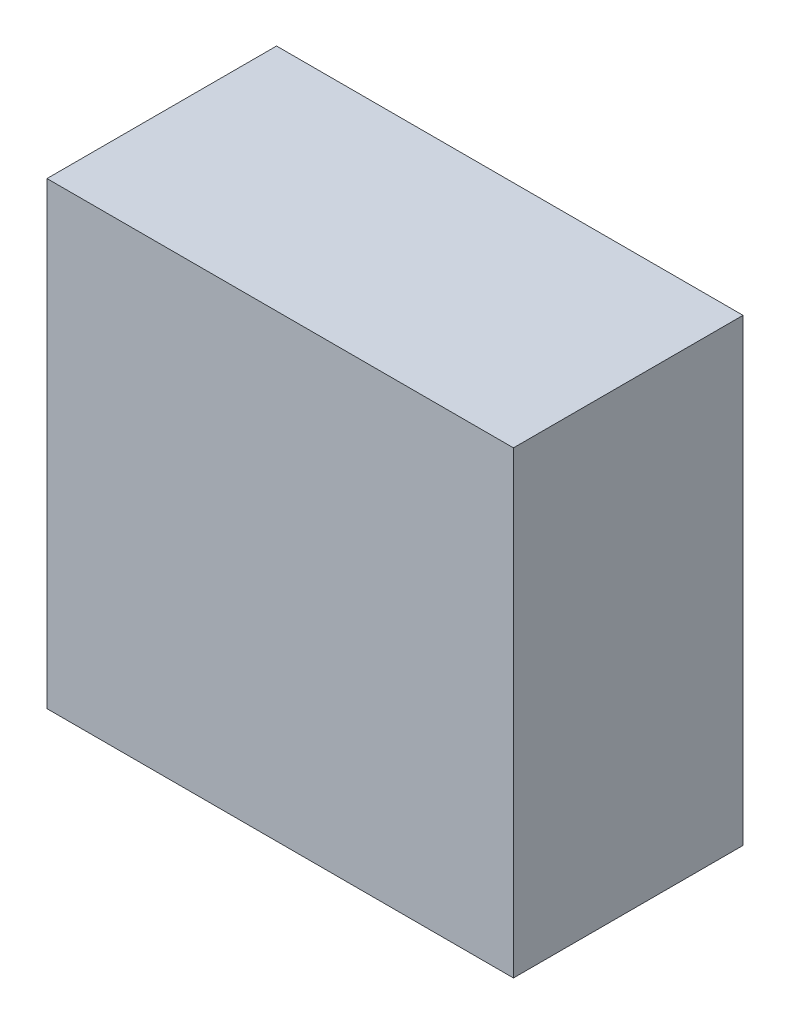
ISO-10303-21;
HEADER;
FILE_DESCRIPTION(('STEP AP214'),'2;1');
FILE_NAME('part.step','',(''),(''),'','','');
FILE_SCHEMA(('AUTOMOTIVE_DESIGN { 1 0 10303 214 1 1 1 1 }'));
ENDSEC;
DATA;
#1=APPLICATION_CONTEXT('core data for automotive mechanical design processes');
#2=APPLICATION_PROTOCOL_DEFINITION('international standard','automotive_design',2000,#1);
#3=PRODUCT_CONTEXT('',#1,'mechanical');
#4=PRODUCT('Part','Part','',(#3));
#5=PRODUCT_RELATED_PRODUCT_CATEGORY('part','',(#4));
#6=PRODUCT_DEFINITION_FORMATION('','',#4);
#7=PRODUCT_DEFINITION_CONTEXT('part definition',#1,'design');
#8=PRODUCT_DEFINITION('design','',#6,#7);
#9=PRODUCT_DEFINITION_SHAPE('','',#8);
#10=(LENGTH_UNIT() NAMED_UNIT(*) SI_UNIT(.MILLI.,.METRE.));
#11=(NAMED_UNIT(*) PLANE_ANGLE_UNIT() SI_UNIT($,.RADIAN.));
#12=(NAMED_UNIT(*) SI_UNIT($,.STERADIAN.) SOLID_ANGLE_UNIT());
#13=UNCERTAINTY_MEASURE_WITH_UNIT(LENGTH_MEASURE(1.E-05),#10,'distance_accuracy_value','');
#14=(GEOMETRIC_REPRESENTATION_CONTEXT(3) GLOBAL_UNCERTAINTY_ASSIGNED_CONTEXT((#13)) GLOBAL_UNIT_ASSIGNED_CONTEXT((#10,
#11,#12)) REPRESENTATION_CONTEXT('',''));
#15=CARTESIAN_POINT('',(0.,0.,0.));
#16=DIRECTION('',(0.,0.,1.));
#17=DIRECTION('',(1.,0.,0.));
#18=AXIS2_PLACEMENT_3D('',#15,#16,#17);
#19=CARTESIAN_POINT('',(203.2,-100.,50.));
#20=DIRECTION('',(0.,0.,1.));
#21=DIRECTION('',(1.,0.,0.));
#22=AXIS2_PLACEMENT_3D('',#19,#20,#21);
#23=PLANE('',#22);
#24=DIRECTION('',(0.,1.,0.));
#25=VECTOR('',#24,1.);
#26=CARTESIAN_POINT('',(0.,-100.,50.));
#27=LINE('',#26,#25);
#28=CARTESIAN_POINT('',(0.,-100.,50.));
#29=VERTEX_POINT('',#28);
#30=CARTESIAN_POINT('',(0.,100.,50.));
#31=VERTEX_POINT('',#30);
#32=EDGE_CURVE('E108',#29,#31,#27,.T.);
#33=ORIENTED_EDGE('',*,*,#32,.F.);
#34=DIRECTION('',(-1.,0.,0.));
#35=VECTOR('',#34,1.);
#36=CARTESIAN_POINT('',(203.2,-100.,50.));
#37=LINE('',#36,#35);
#38=CARTESIAN_POINT('',(203.2,-100.,50.));
#39=VERTEX_POINT('',#38);
#40=EDGE_CURVE('E11',#39,#29,#37,.T.);
#41=ORIENTED_EDGE('',*,*,#40,.F.);
#42=DIRECTION('',(0.,1.,0.));
#43=VECTOR('',#42,1.);
#44=CARTESIAN_POINT('',(203.2,-100.,50.));
#45=LINE('',#44,#43);
#46=CARTESIAN_POINT('',(203.2,100.,50.));
#47=VERTEX_POINT('',#46);
#48=EDGE_CURVE('E103',#39,#47,#45,.T.);
#49=ORIENTED_EDGE('',*,*,#48,.T.);
#50=DIRECTION('',(-1.,0.,0.));
#51=VECTOR('',#50,1.);
#52=CARTESIAN_POINT('',(203.2,100.,50.));
#53=LINE('',#52,#51);
#54=EDGE_CURVE('E46',#47,#31,#53,.T.);
#55=ORIENTED_EDGE('',*,*,#54,.T.);
#56=EDGE_LOOP('',(#33,#41,#49,#55));
#57=FACE_BOUND('',#56,.T.);
#58=ADVANCED_FACE('F43',(#57),#23,.T.);
#59=CARTESIAN_POINT('',(203.2,-100.,50.));
#60=DIRECTION('',(0.,1.,0.));
#61=DIRECTION('',(0.,0.,1.));
#62=AXIS2_PLACEMENT_3D('',#59,#60,#61);
#63=PLANE('',#62);
#64=DIRECTION('',(0.,0.,-1.));
#65=VECTOR('',#64,1.);
#66=CARTESIAN_POINT('',(0.,-100.,50.));
#67=LINE('',#66,#65);
#68=CARTESIAN_POINT('',(0.,-100.,-50.));
#69=VERTEX_POINT('',#68);
#70=EDGE_CURVE('E76',#29,#69,#67,.T.);
#71=ORIENTED_EDGE('',*,*,#70,.T.);
#72=DIRECTION('',(-1.,0.,0.));
#73=VECTOR('',#72,1.);
#74=CARTESIAN_POINT('',(203.2,-100.,-50.));
#75=LINE('',#74,#73);
#76=CARTESIAN_POINT('',(203.2,-100.,-50.));
#77=VERTEX_POINT('',#76);
#78=EDGE_CURVE('E52',#77,#69,#75,.T.);
#79=ORIENTED_EDGE('',*,*,#78,.F.);
#80=DIRECTION('',(0.,0.,-1.));
#81=VECTOR('',#80,1.);
#82=CARTESIAN_POINT('',(203.2,-100.,50.));
#83=LINE('',#82,#81);
#84=EDGE_CURVE('E93',#39,#77,#83,.T.);
#85=ORIENTED_EDGE('',*,*,#84,.F.);
#86=ORIENTED_EDGE('',*,*,#40,.T.);
#87=EDGE_LOOP('',(#71,#79,#85,#86));
#88=FACE_BOUND('',#87,.T.);
#89=ADVANCED_FACE('F118',(#88),#63,.F.);
#90=CARTESIAN_POINT('',(203.2,-100.,-50.));
#91=DIRECTION('',(0.,0.,1.));
#92=DIRECTION('',(1.,0.,0.));
#93=AXIS2_PLACEMENT_3D('',#90,#91,#92);
#94=PLANE('',#93);
#95=DIRECTION('',(0.,1.,0.));
#96=VECTOR('',#95,1.);
#97=CARTESIAN_POINT('',(0.,-100.,-50.));
#98=LINE('',#97,#96);
#99=CARTESIAN_POINT('',(0.,100.,-50.));
#100=VERTEX_POINT('',#99);
#101=EDGE_CURVE('E100',#69,#100,#98,.T.);
#102=ORIENTED_EDGE('',*,*,#101,.T.);
#103=DIRECTION('',(-1.,0.,0.));
#104=VECTOR('',#103,1.);
#105=CARTESIAN_POINT('',(203.2,100.,-50.));
#106=LINE('',#105,#104);
#107=CARTESIAN_POINT('',(203.2,100.,-50.));
#108=VERTEX_POINT('',#107);
#109=EDGE_CURVE('E97',#108,#100,#106,.T.);
#110=ORIENTED_EDGE('',*,*,#109,.F.);
#111=DIRECTION('',(0.,1.,0.));
#112=VECTOR('',#111,1.);
#113=CARTESIAN_POINT('',(203.2,-100.,-50.));
#114=LINE('',#113,#112);
#115=EDGE_CURVE('E88',#77,#108,#114,.T.);
#116=ORIENTED_EDGE('',*,*,#115,.F.);
#117=ORIENTED_EDGE('',*,*,#78,.T.);
#118=EDGE_LOOP('',(#102,#110,#116,#117));
#119=FACE_BOUND('',#118,.T.);
#120=ADVANCED_FACE('F98',(#119),#94,.F.);
#121=CARTESIAN_POINT('',(203.2,100.,50.));
#122=DIRECTION('',(0.,1.,0.));
#123=DIRECTION('',(0.,0.,1.));
#124=AXIS2_PLACEMENT_3D('',#121,#122,#123);
#125=PLANE('',#124);
#126=DIRECTION('',(0.,0.,-1.));
#127=VECTOR('',#126,1.);
#128=CARTESIAN_POINT('',(0.,100.,50.));
#129=LINE('',#128,#127);
#130=EDGE_CURVE('E111',#31,#100,#129,.T.);
#131=ORIENTED_EDGE('',*,*,#130,.F.);
#132=ORIENTED_EDGE('',*,*,#54,.F.);
#133=DIRECTION('',(0.,0.,-1.));
#134=VECTOR('',#133,1.);
#135=CARTESIAN_POINT('',(203.2,100.,50.));
#136=LINE('',#135,#134);
#137=EDGE_CURVE('E92',#47,#108,#136,.T.);
#138=ORIENTED_EDGE('',*,*,#137,.T.);
#139=ORIENTED_EDGE('',*,*,#109,.T.);
#140=EDGE_LOOP('',(#131,#132,#138,#139));
#141=FACE_BOUND('',#140,.T.);
#142=ADVANCED_FACE('F102',(#141),#125,.T.);
#143=CARTESIAN_POINT('',(203.2,0.,0.));
#144=DIRECTION('',(-1.,0.,0.));
#145=DIRECTION('',(0.,0.,1.));
#146=AXIS2_PLACEMENT_3D('',#143,#144,#145);
#147=PLANE('',#146);
#148=ORIENTED_EDGE('',*,*,#48,.F.);
#149=ORIENTED_EDGE('',*,*,#84,.T.);
#150=ORIENTED_EDGE('',*,*,#115,.T.);
#151=ORIENTED_EDGE('',*,*,#137,.F.);
#152=EDGE_LOOP('',(#148,#149,#150,#151));
#153=FACE_BOUND('',#152,.T.);
#154=ADVANCED_FACE('F91',(#153),#147,.F.);
#155=CARTESIAN_POINT('',(0.,0.,0.));
#156=DIRECTION('',(-1.,0.,0.));
#157=DIRECTION('',(0.,0.,1.));
#158=AXIS2_PLACEMENT_3D('',#155,#156,#157);
#159=PLANE('',#158);
#160=ORIENTED_EDGE('',*,*,#32,.T.);
#161=ORIENTED_EDGE('',*,*,#130,.T.);
#162=ORIENTED_EDGE('',*,*,#101,.F.);
#163=ORIENTED_EDGE('',*,*,#70,.F.);
#164=EDGE_LOOP('',(#160,#161,#162,#163));
#165=FACE_BOUND('',#164,.T.);
#166=ADVANCED_FACE('F116',(#165),#159,.T.);
#167=CLOSED_SHELL('',(#58,#89,#120,#142,#154,#166));
#168=MANIFOLD_SOLID_BREP('B2',#167);
#169=ADVANCED_BREP_SHAPE_REPRESENTATION('',(#18,#168),#14);
#170=SHAPE_DEFINITION_REPRESENTATION(#9,#169);
ENDSEC;
END-ISO-10303-21;
